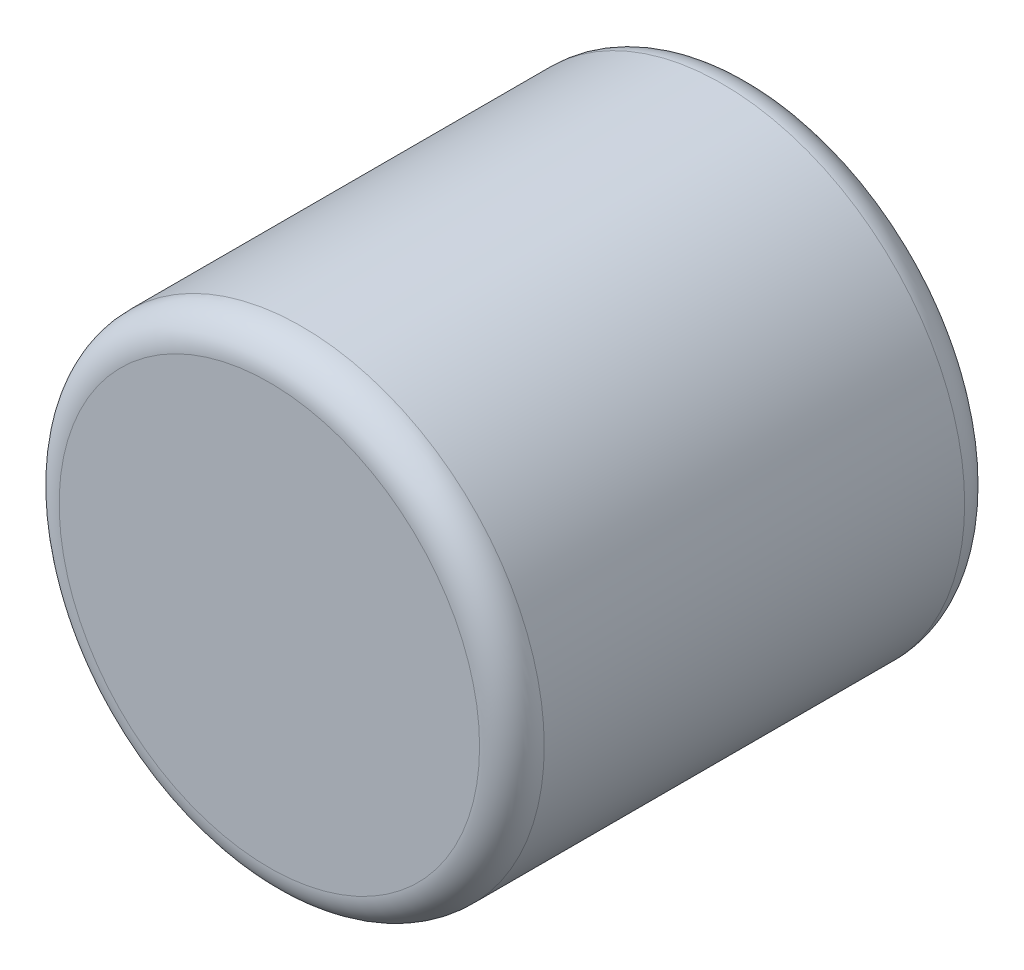
ISO-10303-21;
HEADER;
FILE_DESCRIPTION(('STEP AP214'),'2;1');
FILE_NAME('part.step','',(''),(''),'','','');
FILE_SCHEMA(('AUTOMOTIVE_DESIGN { 1 0 10303 214 1 1 1 1 }'));
ENDSEC;
DATA;
#1=APPLICATION_CONTEXT('core data for automotive mechanical design processes');
#2=APPLICATION_PROTOCOL_DEFINITION('international standard','automotive_design',2000,#1);
#3=PRODUCT_CONTEXT('',#1,'mechanical');
#4=PRODUCT('Part','Part','',(#3));
#5=PRODUCT_RELATED_PRODUCT_CATEGORY('part','',(#4));
#6=PRODUCT_DEFINITION_FORMATION('','',#4);
#7=PRODUCT_DEFINITION_CONTEXT('part definition',#1,'design');
#8=PRODUCT_DEFINITION('design','',#6,#7);
#9=PRODUCT_DEFINITION_SHAPE('','',#8);
#10=(LENGTH_UNIT() NAMED_UNIT(*) SI_UNIT(.MILLI.,.METRE.));
#11=(NAMED_UNIT(*) PLANE_ANGLE_UNIT() SI_UNIT($,.RADIAN.));
#12=(NAMED_UNIT(*) SI_UNIT($,.STERADIAN.) SOLID_ANGLE_UNIT());
#13=UNCERTAINTY_MEASURE_WITH_UNIT(LENGTH_MEASURE(1.E-05),#10,'distance_accuracy_value','');
#14=(GEOMETRIC_REPRESENTATION_CONTEXT(3) GLOBAL_UNCERTAINTY_ASSIGNED_CONTEXT((#13)) GLOBAL_UNIT_ASSIGNED_CONTEXT((#10,
#11,#12)) REPRESENTATION_CONTEXT('',''));
#15=CARTESIAN_POINT('',(0.,0.,0.));
#16=DIRECTION('',(0.,0.,1.));
#17=DIRECTION('',(1.,0.,0.));
#18=AXIS2_PLACEMENT_3D('',#15,#16,#17);
#19=CARTESIAN_POINT('',(0.,0.,3.));
#20=DIRECTION('',(0.,0.,-1.));
#21=DIRECTION('',(-1.,0.,0.));
#22=AXIS2_PLACEMENT_3D('',#19,#20,#21);
#23=CYLINDRICAL_SURFACE('',#22,1.5);
#24=CARTESIAN_POINT('',(0.,0.,2.8));
#25=DIRECTION('',(0.,0.,1.));
#26=DIRECTION('',(1.,0.,0.));
#27=AXIS2_PLACEMENT_3D('',#24,#25,#26);
#28=CIRCLE('',#27,1.5);
#29=CARTESIAN_POINT('',(1.5,0.,2.8));
#30=VERTEX_POINT('',#29);
#31=EDGE_CURVE('E37',#30,#30,#28,.F.);
#32=ORIENTED_EDGE('',*,*,#31,.T.);
#33=EDGE_LOOP('',(#32));
#34=FACE_BOUND('',#33,.T.);
#35=CARTESIAN_POINT('',(0.,0.,0.2));
#36=DIRECTION('',(0.,0.,1.));
#37=DIRECTION('',(1.,0.,0.));
#38=AXIS2_PLACEMENT_3D('',#35,#36,#37);
#39=CIRCLE('',#38,1.5);
#40=CARTESIAN_POINT('',(1.5,0.,0.2));
#41=VERTEX_POINT('',#40);
#42=EDGE_CURVE('E41',#41,#41,#39,.T.);
#43=ORIENTED_EDGE('',*,*,#42,.T.);
#44=EDGE_LOOP('',(#43));
#45=FACE_BOUND('',#44,.T.);
#46=ADVANCED_FACE('F30',(#34,#45),#23,.T.);
#47=CARTESIAN_POINT('',(0.,0.,3.));
#48=DIRECTION('',(0.,0.,1.));
#49=DIRECTION('',(1.,0.,0.));
#50=AXIS2_PLACEMENT_3D('',#47,#48,#49);
#51=PLANE('',#50);
#52=CARTESIAN_POINT('',(0.,0.,3.));
#53=DIRECTION('',(0.,0.,1.));
#54=DIRECTION('',(1.,0.,0.));
#55=AXIS2_PLACEMENT_3D('',#52,#53,#54);
#56=CIRCLE('',#55,1.3);
#57=CARTESIAN_POINT('',(1.3,0.,3.));
#58=VERTEX_POINT('',#57);
#59=EDGE_CURVE('E45',#58,#58,#56,.T.);
#60=ORIENTED_EDGE('',*,*,#59,.T.);
#61=EDGE_LOOP('',(#60));
#62=FACE_BOUND('',#61,.T.);
#63=ADVANCED_FACE('F51',(#62),#51,.T.);
#64=CARTESIAN_POINT('',(0.,0.,0.));
#65=DIRECTION('',(0.,0.,1.));
#66=DIRECTION('',(1.,0.,0.));
#67=AXIS2_PLACEMENT_3D('',#64,#65,#66);
#68=PLANE('',#67);
#69=CARTESIAN_POINT('',(0.,0.,0.));
#70=DIRECTION('',(0.,0.,1.));
#71=DIRECTION('',(1.,0.,0.));
#72=AXIS2_PLACEMENT_3D('',#69,#70,#71);
#73=CIRCLE('',#72,1.3);
#74=CARTESIAN_POINT('',(1.3,0.,0.));
#75=VERTEX_POINT('',#74);
#76=EDGE_CURVE('E10',#75,#75,#73,.F.);
#77=ORIENTED_EDGE('',*,*,#76,.T.);
#78=EDGE_LOOP('',(#77));
#79=FACE_BOUND('',#78,.T.);
#80=ADVANCED_FACE('F55',(#79),#68,.F.);
#81=CARTESIAN_POINT('',(0.,0.,2.8));
#82=DIRECTION('',(0.,0.,1.));
#83=DIRECTION('',(1.,0.,0.));
#84=AXIS2_PLACEMENT_3D('',#81,#82,#83);
#85=TOROIDAL_SURFACE('',#84,1.3,0.2);
#86=ORIENTED_EDGE('',*,*,#31,.F.);
#87=EDGE_LOOP('',(#86));
#88=FACE_BOUND('',#87,.T.);
#89=ORIENTED_EDGE('',*,*,#59,.F.);
#90=EDGE_LOOP('',(#89));
#91=FACE_BOUND('',#90,.T.);
#92=ADVANCED_FACE('F53',(#88,#91),#85,.T.);
#93=CARTESIAN_POINT('',(0.,0.,0.2));
#94=DIRECTION('',(0.,0.,1.));
#95=DIRECTION('',(1.,0.,0.));
#96=AXIS2_PLACEMENT_3D('',#93,#94,#95);
#97=TOROIDAL_SURFACE('',#96,1.3,0.2);
#98=ORIENTED_EDGE('',*,*,#76,.F.);
#99=EDGE_LOOP('',(#98));
#100=FACE_BOUND('',#99,.T.);
#101=ORIENTED_EDGE('',*,*,#42,.F.);
#102=EDGE_LOOP('',(#101));
#103=FACE_BOUND('',#102,.T.);
#104=ADVANCED_FACE('F32',(#100,#103),#97,.T.);
#105=CLOSED_SHELL('',(#46,#63,#80,#92,#104));
#106=MANIFOLD_SOLID_BREP('B2',#105);
#107=ADVANCED_BREP_SHAPE_REPRESENTATION('',(#18,#106),#14);
#108=SHAPE_DEFINITION_REPRESENTATION(#9,#107);
ENDSEC;
END-ISO-10303-21;
